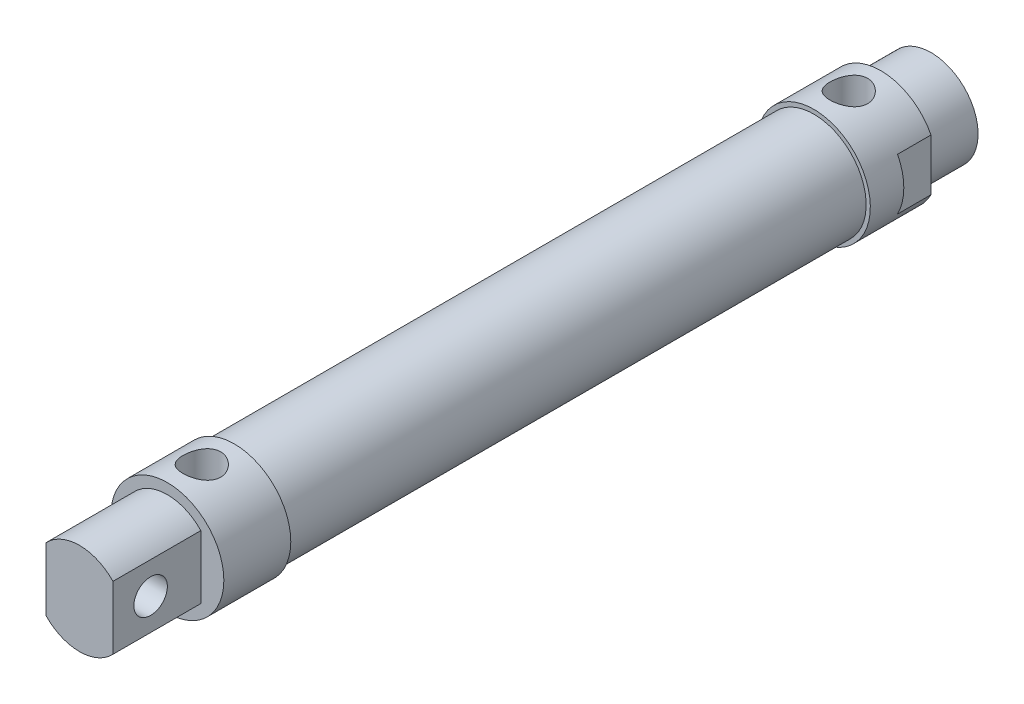
ISO-10303-21;
HEADER;
FILE_DESCRIPTION(('STEP AP214'),'2;1');
FILE_NAME('part.step','',(''),(''),'','','');
FILE_SCHEMA(('AUTOMOTIVE_DESIGN { 1 0 10303 214 1 1 1 1 }'));
ENDSEC;
DATA;
#1=APPLICATION_CONTEXT('core data for automotive mechanical design processes');
#2=APPLICATION_PROTOCOL_DEFINITION('international standard','automotive_design',2000,#1);
#3=PRODUCT_CONTEXT('',#1,'mechanical');
#4=PRODUCT('Part','Part','',(#3));
#5=PRODUCT_RELATED_PRODUCT_CATEGORY('part','',(#4));
#6=PRODUCT_DEFINITION_FORMATION('','',#4);
#7=PRODUCT_DEFINITION_CONTEXT('part definition',#1,'design');
#8=PRODUCT_DEFINITION('design','',#6,#7);
#9=PRODUCT_DEFINITION_SHAPE('','',#8);
#10=(LENGTH_UNIT() NAMED_UNIT(*) SI_UNIT(.MILLI.,.METRE.));
#11=(NAMED_UNIT(*) PLANE_ANGLE_UNIT() SI_UNIT($,.RADIAN.));
#12=(NAMED_UNIT(*) SI_UNIT($,.STERADIAN.) SOLID_ANGLE_UNIT());
#13=UNCERTAINTY_MEASURE_WITH_UNIT(LENGTH_MEASURE(1.E-05),#10,'distance_accuracy_value','');
#14=(GEOMETRIC_REPRESENTATION_CONTEXT(3) GLOBAL_UNCERTAINTY_ASSIGNED_CONTEXT((#13)) GLOBAL_UNIT_ASSIGNED_CONTEXT((#10,
#11,#12)) REPRESENTATION_CONTEXT('',''));
#15=CARTESIAN_POINT('',(0.,0.,0.));
#16=DIRECTION('',(0.,0.,1.));
#17=DIRECTION('',(1.,0.,0.));
#18=AXIS2_PLACEMENT_3D('',#15,#16,#17);
#19=CARTESIAN_POINT('',(0.,0.,-28.));
#20=DIRECTION('',(0.,0.,1.));
#21=DIRECTION('',(1.,0.,0.));
#22=AXIS2_PLACEMENT_3D('',#19,#20,#21);
#23=CYLINDRICAL_SURFACE('',#22,13.5);
#24=CARTESIAN_POINT('',(0.,13.5,-3.83214366522298));
#25=CARTESIAN_POINT('',(-0.245535132990254,13.5000006885425,-3.83214252343059));
#26=CARTESIAN_POINT('',(-0.491063375423474,13.4932396278395,-3.85230486279545));
#27=CARTESIAN_POINT('',(-0.974887923928375,13.4669344591476,-3.93217465490046));
#28=CARTESIAN_POINT('',(-1.21318347653468,13.4473890240969,-3.99188621299313));
#29=CARTESIAN_POINT('',(-1.67549755275799,13.3976388557899,-4.14858026045119));
#30=CARTESIAN_POINT('',(-1.89953921648715,13.3674519478884,-4.2455004462897));
#31=CARTESIAN_POINT('',(-2.32818721562396,13.2995000572804,-4.47357894299554));
#32=CARTESIAN_POINT('',(-2.53278970631418,13.2617335800502,-4.60474400773467));
#33=CARTESIAN_POINT('',(-2.92383753760019,13.1811342499351,-4.90235978708737));
#34=CARTESIAN_POINT('',(-3.10951665134237,13.1381800408698,-5.06978421939523));
#35=CARTESIAN_POINT('',(-3.4507471171594,13.052714165241,-5.43309586140249));
#36=CARTESIAN_POINT('',(-3.60629183470265,13.0102025980768,-5.62898932240115));
#37=CARTESIAN_POINT('',(-3.8872122400253,12.9290999614752,-6.05057668360718));
#38=CARTESIAN_POINT('',(-4.01159186199438,12.8906567673979,-6.27696549401804));
#39=CARTESIAN_POINT('',(-4.22018493245001,12.8238887438451,-6.74893609028592));
#40=CARTESIAN_POINT('',(-4.30441063824142,12.7955608272636,-6.9945119924534));
#41=CARTESIAN_POINT('',(-4.42743057679029,12.7535086470929,-7.48917316196003));
#42=CARTESIAN_POINT('',(-4.46766051721948,12.7393243095257,-7.73786110343059));
#43=CARTESIAN_POINT('',(-4.50603505500863,12.7258045484346,-8.23883055891762));
#44=CARTESIAN_POINT('',(-4.5041926572342,12.7264645364209,-8.49111093838891));
#45=CARTESIAN_POINT('',(-4.45958956665199,12.7421556749886,-8.97985850225647));
#46=CARTESIAN_POINT('',(-4.41870260920247,12.756528712653,-9.21652147846926));
#47=CARTESIAN_POINT('',(-4.30022773277463,12.7969495962214,-9.6794140535589));
#48=CARTESIAN_POINT('',(-4.22263541965274,12.8229988399107,-9.90564239970517));
#49=CARTESIAN_POINT('',(-4.03172576128583,12.8843060012851,-10.3455010383506));
#50=CARTESIAN_POINT('',(-3.91785321918668,12.919705460792,-10.5588697798267));
#51=CARTESIAN_POINT('',(-3.65800097836013,12.9956651358059,-10.9640627524909));
#52=CARTESIAN_POINT('',(-3.51201200563693,13.036226840543,-11.1558807364257));
#53=CARTESIAN_POINT('',(-3.18307199707122,13.1205298125777,-11.5230558569438));
#54=CARTESIAN_POINT('',(-2.99858917534371,13.1643265209758,-11.6970307905131));
#55=CARTESIAN_POINT('',(-2.60252806486498,13.2483122274088,-12.011934365209));
#56=CARTESIAN_POINT('',(-2.39094718047358,13.2885008792109,-12.1528598369634));
#57=CARTESIAN_POINT('',(-1.94376425870829,13.3612698572029,-12.3987770162806));
#58=CARTESIAN_POINT('',(-1.70794474387354,13.3937707503623,-12.5033983762562));
#59=CARTESIAN_POINT('',(-1.22071087514026,13.446925521499,-12.6710579480237));
#60=CARTESIAN_POINT('',(-0.969301971697287,13.4675835144694,-12.7341106046285));
#61=CARTESIAN_POINT('',(-0.469727232881875,13.494043218215,-12.8143941623236));
#62=CARTESIAN_POINT('',(-0.221893199391811,13.5004500825178,-12.8334928065004));
#63=CARTESIAN_POINT('',(0.273487814821069,13.4995006212672,-12.8306466340299));
#64=CARTESIAN_POINT('',(0.521034836938427,13.4921466188713,-12.8087087453135));
#65=CARTESIAN_POINT('',(1.00133939836915,13.4649011122697,-12.7258900804112));
#66=CARTESIAN_POINT('',(1.23431763075679,13.4453789420037,-12.6661557380003));
#67=CARTESIAN_POINT('',(1.68685181360808,13.3961331073531,-12.5108731651227));
#68=CARTESIAN_POINT('',(1.90640604828873,13.3664081421004,-12.4153203676179));
#69=CARTESIAN_POINT('',(2.33229733376973,13.298801907928,-12.1883267219394));
#70=CARTESIAN_POINT('',(2.53813481647716,13.2607266640104,-12.0560079954487));
#71=CARTESIAN_POINT('',(2.92529173561014,13.1807364262318,-11.7602699901623));
#72=CARTESIAN_POINT('',(3.10660365508009,13.1388202617222,-11.59684121308));
#73=CARTESIAN_POINT('',(3.44813628512835,13.05345815912,-11.2347392856933));
#74=CARTESIAN_POINT('',(3.60702436160597,13.0100292489343,-11.0348021440521));
#75=CARTESIAN_POINT('',(3.88915885045608,12.9284987982619,-10.610171610074));
#76=CARTESIAN_POINT('',(4.01240496568956,12.8903973021901,-10.3854780113696));
#77=CARTESIAN_POINT('',(4.21918618687362,12.8242076306123,-9.91761509641845));
#78=CARTESIAN_POINT('',(4.30280159474259,12.796099235684,-9.67448430896353));
#79=CARTESIAN_POINT('',(4.4275260004171,12.7534874537902,-9.17643974002439));
#80=CARTESIAN_POINT('',(4.46865414729273,12.7389779380638,-8.92153132090341));
#81=CARTESIAN_POINT('',(4.50574327114804,12.725903649338,-8.42125673303886));
#82=CARTESIAN_POINT('',(4.5039161578878,12.7265580115837,-8.17607313393227));
#83=CARTESIAN_POINT('',(4.46059032051912,12.741807142074,-7.6897008280737));
#84=CARTESIAN_POINT('',(4.41909395756363,12.7564010806213,-7.44851188442508));
#85=CARTESIAN_POINT('',(4.29917315908205,12.7973035937201,-6.98153318171185));
#86=CARTESIAN_POINT('',(4.22146505706981,12.8233844110115,-6.75553795270274));
#87=CARTESIAN_POINT('',(4.03190714591886,12.8842379468311,-6.31962033400077));
#88=CARTESIAN_POINT('',(3.92004975849213,12.9190125943527,-6.10970152487695));
#89=CARTESIAN_POINT('',(3.65967311662543,12.9952273151721,-5.70196715056988));
#90=CARTESIAN_POINT('',(3.50976709244061,13.0368920238962,-5.50507940668024));
#91=CARTESIAN_POINT('',(3.17989297411042,13.1212510327464,-5.13853950499408));
#92=CARTESIAN_POINT('',(2.99991638003167,13.1639456210568,-4.96889507462664));
#93=CARTESIAN_POINT('',(2.6065870061431,13.2475513736495,-4.65499380992167));
#94=CARTESIAN_POINT('',(2.39220681074878,13.2883281810565,-4.51198410034348));
#95=CARTESIAN_POINT('',(1.94110810832981,13.3616696027675,-4.26418673539507));
#96=CARTESIAN_POINT('',(1.70439533159557,13.3942363158568,-4.15938930857379));
#97=CARTESIAN_POINT('',(1.22622141240439,13.4462481780844,-3.99539631902395));
#98=CARTESIAN_POINT('',(0.98544490954384,13.4662145590135,-3.93437256703778));
#99=CARTESIAN_POINT('',(0.496441872046111,13.49308831789,-3.85275240217591));
#100=CARTESIAN_POINT('',(0.248217415059359,13.4999993039357,-3.83214481948856));
#101=CARTESIAN_POINT('',(0.,13.5,-3.83214366522298));
#102=B_SPLINE_CURVE_WITH_KNOTS('',3,(#24,#25,#26,#27,#28,#29,#30,#31,#32,#33,#34,#35,#36,#37,
#38,#39,#40,#41,#42,#43,#44,#45,#46,#47,#48,#49,#50,#51,#52,#53,#54,#55,#56,#57,#58,#59,#60,#61,
#62,#63,#64,#65,#66,#67,#68,#69,#70,#71,#72,#73,#74,#75,#76,#77,#78,#79,#80,#81,#82,#83,#84,#85,
#86,#87,#88,#89,#90,#91,#92,#93,#94,#95,#96,#97,#98,#99,#100,#101),.UNSPECIFIED.,.T.,.F.,(4,2,2,
2,2,2,2,2,2,2,2,2,2,2,2,2,2,2,2,2,2,2,2,2,2,2,2,2,2,2,2,2,2,2,2,2,2,2,4),(0.,0.735691977117049,
1.47146033370384,2.20600202791623,2.94068870009595,3.69831079272402,4.45609949793886,
5.23567731705617,6.0150170111775,6.7680866583828,7.52092352943684,8.23935719484116,
8.95787688856029,9.68796770204448,10.4182696151829,11.1866987615751,11.9552015685614,
12.7313282543297,13.507185099538,14.2494112429462,14.9915120924515,15.7121171090832,
16.4328140378483,17.1724679930317,17.9123481370487,18.6858460296974,19.4593503706385,
20.2312806222683,21.0028628118264,21.7348049729552,22.4667035708755,23.1847014186824,
23.9028587179826,24.6523530011948,25.4020595006336,26.1809847376431,26.9597106519241,
27.7036451268852,28.4473739717799),.UNSPECIFIED.);
#103=CARTESIAN_POINT('',(0.,13.5,-3.83214366522298));
#104=VERTEX_POINT('',#103);
#105=EDGE_CURVE('E35',#104,#104,#102,.T.);
#106=ORIENTED_EDGE('',*,*,#105,.T.);
#107=EDGE_LOOP('',(#106));
#108=FACE_BOUND('',#107,.T.);
#109=CARTESIAN_POINT('',(0.,0.,0.));
#110=DIRECTION('',(0.,0.,-1.));
#111=DIRECTION('',(-1.,0.,0.));
#112=AXIS2_PLACEMENT_3D('',#109,#110,#111);
#113=CIRCLE('',#112,13.5);
#114=CARTESIAN_POINT('',(-13.5,0.,0.));
#115=VERTEX_POINT('',#114);
#116=EDGE_CURVE('E166',#115,#115,#113,.T.);
#117=ORIENTED_EDGE('',*,*,#116,.T.);
#118=EDGE_LOOP('',(#117));
#119=FACE_BOUND('',#118,.T.);
#120=CARTESIAN_POINT('',(0.,0.,-16.));
#121=DIRECTION('',(0.,0.,-1.));
#122=DIRECTION('',(-1.,0.,0.));
#123=AXIS2_PLACEMENT_3D('',#120,#121,#122);
#124=CIRCLE('',#123,13.5);
#125=CARTESIAN_POINT('',(-12.,6.18465843842649,-16.));
#126=VERTEX_POINT('',#125);
#127=CARTESIAN_POINT('',(12.,6.18465843842649,-16.));
#128=VERTEX_POINT('',#127);
#129=EDGE_CURVE('E51',#126,#128,#124,.T.);
#130=ORIENTED_EDGE('',*,*,#129,.F.);
#131=DIRECTION('',(0.,0.,-1.));
#132=VECTOR('',#131,1.);
#133=CARTESIAN_POINT('',(-12.,6.18465843842649,-8.));
#134=LINE('',#133,#132);
#135=CARTESIAN_POINT('',(-12.,6.18465843842649,-8.));
#136=VERTEX_POINT('',#135);
#137=EDGE_CURVE('E129',#136,#126,#134,.T.);
#138=ORIENTED_EDGE('',*,*,#137,.F.);
#139=CARTESIAN_POINT('',(0.,0.,-8.));
#140=DIRECTION('',(0.,0.,-1.));
#141=DIRECTION('',(-1.,0.,0.));
#142=AXIS2_PLACEMENT_3D('',#139,#140,#141);
#143=CIRCLE('',#142,13.5);
#144=CARTESIAN_POINT('',(-12.,-6.18465843842649,-8.));
#145=VERTEX_POINT('',#144);
#146=EDGE_CURVE('E120',#145,#136,#143,.T.);
#147=ORIENTED_EDGE('',*,*,#146,.F.);
#148=DIRECTION('',(0.,0.,-1.));
#149=VECTOR('',#148,1.);
#150=CARTESIAN_POINT('',(-12.,-6.18465843842649,-8.));
#151=LINE('',#150,#149);
#152=CARTESIAN_POINT('',(-12.,-6.18465843842649,-16.));
#153=VERTEX_POINT('',#152);
#154=EDGE_CURVE('E111',#145,#153,#151,.T.);
#155=ORIENTED_EDGE('',*,*,#154,.T.);
#156=CARTESIAN_POINT('',(12.,-6.18465843842649,-16.));
#157=VERTEX_POINT('',#156);
#158=EDGE_CURVE('E100',#157,#153,#124,.T.);
#159=ORIENTED_EDGE('',*,*,#158,.F.);
#160=DIRECTION('',(0.,0.,-1.));
#161=VECTOR('',#160,1.);
#162=CARTESIAN_POINT('',(12.,-6.18465843842649,-8.));
#163=LINE('',#162,#161);
#164=CARTESIAN_POINT('',(12.,-6.18465843842649,-8.));
#165=VERTEX_POINT('',#164);
#166=EDGE_CURVE('E109',#165,#157,#163,.T.);
#167=ORIENTED_EDGE('',*,*,#166,.F.);
#168=CARTESIAN_POINT('',(0.,0.,-8.));
#169=DIRECTION('',(0.,0.,-1.));
#170=DIRECTION('',(-1.,0.,0.));
#171=AXIS2_PLACEMENT_3D('',#168,#169,#170);
#172=CIRCLE('',#171,13.5);
#173=CARTESIAN_POINT('',(12.,6.18465843842649,-8.));
#174=VERTEX_POINT('',#173);
#175=EDGE_CURVE('E122',#174,#165,#172,.T.);
#176=ORIENTED_EDGE('',*,*,#175,.F.);
#177=DIRECTION('',(0.,0.,-1.));
#178=VECTOR('',#177,1.);
#179=CARTESIAN_POINT('',(12.,6.18465843842649,-8.));
#180=LINE('',#179,#178);
#181=EDGE_CURVE('E118',#174,#128,#180,.T.);
#182=ORIENTED_EDGE('',*,*,#181,.T.);
#183=EDGE_LOOP('',(#130,#138,#147,#155,#159,#167,#176,#182));
#184=FACE_BOUND('',#183,.T.);
#185=ADVANCED_FACE('F31',(#108,#119,#184),#23,.T.);
#186=CARTESIAN_POINT('',(-12.,6.18465843842649,-8.));
#187=DIRECTION('',(1.,0.,0.));
#188=DIRECTION('',(0.,0.,-1.));
#189=AXIS2_PLACEMENT_3D('',#186,#187,#188);
#190=PLANE('',#189);
#191=DIRECTION('',(0.,1.,0.));
#192=VECTOR('',#191,1.);
#193=CARTESIAN_POINT('',(-12.,6.18465843842649,-16.));
#194=LINE('',#193,#192);
#195=EDGE_CURVE('E444',#153,#126,#194,.T.);
#196=ORIENTED_EDGE('',*,*,#195,.F.);
#197=ORIENTED_EDGE('',*,*,#154,.F.);
#198=DIRECTION('',(0.,-1.,0.));
#199=VECTOR('',#198,1.);
#200=CARTESIAN_POINT('',(-12.,6.18465843842649,-8.));
#201=LINE('',#200,#199);
#202=EDGE_CURVE('E126',#136,#145,#201,.T.);
#203=ORIENTED_EDGE('',*,*,#202,.F.);
#204=ORIENTED_EDGE('',*,*,#137,.T.);
#205=EDGE_LOOP('',(#196,#197,#203,#204));
#206=FACE_BOUND('',#205,.T.);
#207=ADVANCED_FACE('F212',(#206),#190,.F.);
#208=CARTESIAN_POINT('',(12.,6.18465843842649,-8.));
#209=DIRECTION('',(-1.,0.,0.));
#210=DIRECTION('',(0.,-1.,0.));
#211=AXIS2_PLACEMENT_3D('',#208,#209,#210);
#212=PLANE('',#211);
#213=DIRECTION('',(0.,-1.,0.));
#214=VECTOR('',#213,1.);
#215=CARTESIAN_POINT('',(12.,6.18465843842649,-16.));
#216=LINE('',#215,#214);
#217=EDGE_CURVE('E12',#128,#157,#216,.T.);
#218=ORIENTED_EDGE('',*,*,#217,.F.);
#219=ORIENTED_EDGE('',*,*,#181,.F.);
#220=DIRECTION('',(0.,1.,0.));
#221=VECTOR('',#220,1.);
#222=CARTESIAN_POINT('',(12.,6.18465843842649,-8.));
#223=LINE('',#222,#221);
#224=EDGE_CURVE('E117',#165,#174,#223,.T.);
#225=ORIENTED_EDGE('',*,*,#224,.F.);
#226=ORIENTED_EDGE('',*,*,#166,.T.);
#227=EDGE_LOOP('',(#218,#219,#225,#226));
#228=FACE_BOUND('',#227,.T.);
#229=ADVANCED_FACE('F115',(#228),#212,.F.);
#230=CARTESIAN_POINT('',(0.,0.,175.5));
#231=DIRECTION('',(0.,0.,-1.));
#232=DIRECTION('',(-1.,0.,0.));
#233=AXIS2_PLACEMENT_3D('',#230,#231,#232);
#234=CYLINDRICAL_SURFACE('',#233,13.5);
#235=CARTESIAN_POINT('',(0.,13.5,150.76682811308));
#236=CARTESIAN_POINT('',(-0.245535132990255,13.5000006885425,150.766829254872));
#237=CARTESIAN_POINT('',(-0.491063375423474,13.4932396278395,150.746666915507));
#238=CARTESIAN_POINT('',(-0.974887923928374,13.4669344591476,150.666797123402));
#239=CARTESIAN_POINT('',(-1.21318347653468,13.4473890240969,150.60708556531));
#240=CARTESIAN_POINT('',(-1.67549755275799,13.3976388557899,150.450391517852));
#241=CARTESIAN_POINT('',(-1.89953921648715,13.3674519478884,150.353471332013));
#242=CARTESIAN_POINT('',(-2.32818721562396,13.2995000572804,150.125392835307));
#243=CARTESIAN_POINT('',(-2.53278970631418,13.2617335800501,149.994227770568));
#244=CARTESIAN_POINT('',(-2.9238375376002,13.1811342499351,149.696611991216));
#245=CARTESIAN_POINT('',(-3.10951665134238,13.1381800408698,149.529187558908));
#246=CARTESIAN_POINT('',(-3.4507471171594,13.052714165241,149.1658759169));
#247=CARTESIAN_POINT('',(-3.60629183470265,13.0102025980768,148.969982455902));
#248=CARTESIAN_POINT('',(-3.88721224002529,12.9290999614752,148.548395094696));
#249=CARTESIAN_POINT('',(-4.01159186199438,12.8906567673979,148.322006284285));
#250=CARTESIAN_POINT('',(-4.22018493245001,12.8238887438451,147.850035688017));
#251=CARTESIAN_POINT('',(-4.30441063824142,12.7955608272636,147.60445978585));
#252=CARTESIAN_POINT('',(-4.42743057679029,12.7535086470929,147.109798616343));
#253=CARTESIAN_POINT('',(-4.46766051721948,12.7393243095257,146.861110674872));
#254=CARTESIAN_POINT('',(-4.50603505500863,12.7258045484346,146.360141219385));
#255=CARTESIAN_POINT('',(-4.5041926572342,12.7264645364209,146.107860839914));
#256=CARTESIAN_POINT('',(-4.45958956665199,12.7421556749886,145.619113276046));
#257=CARTESIAN_POINT('',(-4.41870260920246,12.756528712653,145.382450299834));
#258=CARTESIAN_POINT('',(-4.30022773277462,12.7969495962214,144.919557724744));
#259=CARTESIAN_POINT('',(-4.22263541965274,12.8229988399107,144.693329378598));
#260=CARTESIAN_POINT('',(-4.03172576128584,12.8843060012851,144.253470739952));
#261=CARTESIAN_POINT('',(-3.91785321918669,12.919705460792,144.040101998476));
#262=CARTESIAN_POINT('',(-3.65800097836015,12.9956651358059,143.634909025812));
#263=CARTESIAN_POINT('',(-3.51201200563693,13.036226840543,143.443091041877));
#264=CARTESIAN_POINT('',(-3.18307199707121,13.1205298125777,143.075915921359));
#265=CARTESIAN_POINT('',(-2.99858917534371,13.1643265209758,142.90194098779));
#266=CARTESIAN_POINT('',(-2.60252806486499,13.2483122274088,142.587037413094));
#267=CARTESIAN_POINT('',(-2.3909471804736,13.2885008792109,142.44611194134));
#268=CARTESIAN_POINT('',(-1.9437642587083,13.3612698572029,142.200194762022));
#269=CARTESIAN_POINT('',(-1.70794474387355,13.3937707503623,142.095573402047));
#270=CARTESIAN_POINT('',(-1.22071087514026,13.446925521499,141.927913830279));
#271=CARTESIAN_POINT('',(-0.969301971697278,13.4675835144694,141.864861173674));
#272=CARTESIAN_POINT('',(-0.469727232881862,13.494043218215,141.784577615979));
#273=CARTESIAN_POINT('',(-0.221893199391799,13.5004500825178,141.765478971803));
#274=CARTESIAN_POINT('',(0.273487814821077,13.4995006212672,141.768325144273));
#275=CARTESIAN_POINT('',(0.521034836938433,13.4921466188713,141.790263032989));
#276=CARTESIAN_POINT('',(1.00133939836915,13.4649011122697,141.873081697892));
#277=CARTESIAN_POINT('',(1.2343176307568,13.4453789420037,141.932816040303));
#278=CARTESIAN_POINT('',(1.68685181360808,13.3961331073531,142.08809861318));
#279=CARTESIAN_POINT('',(1.90640604828873,13.3664081421004,142.183651410685));
#280=CARTESIAN_POINT('',(2.33229733376973,13.298801907928,142.410645056363));
#281=CARTESIAN_POINT('',(2.53813481647716,13.2607266640104,142.542963782854));
#282=CARTESIAN_POINT('',(2.92529173561014,13.1807364262318,142.838701788141));
#283=CARTESIAN_POINT('',(3.1066036550801,13.1388202617222,143.002130565223));
#284=CARTESIAN_POINT('',(3.44813628512835,13.05345815912,143.36423249261));
#285=CARTESIAN_POINT('',(3.60702436160597,13.0100292489343,143.564169634251));
#286=CARTESIAN_POINT('',(3.88915885045609,12.9284987982619,143.988800168229));
#287=CARTESIAN_POINT('',(4.01240496568956,12.8903973021901,144.213493766933));
#288=CARTESIAN_POINT('',(4.21918618687362,12.8242076306123,144.681356681884));
#289=CARTESIAN_POINT('',(4.30280159474259,12.796099235684,144.924487469339));
#290=CARTESIAN_POINT('',(4.4275260004171,12.7534874537902,145.422532038279));
#291=CARTESIAN_POINT('',(4.46865414729273,12.7389779380638,145.6774404574));
#292=CARTESIAN_POINT('',(4.50574327114804,12.725903649338,146.177715045264));
#293=CARTESIAN_POINT('',(4.5039161578878,12.7265580115837,146.422898644371));
#294=CARTESIAN_POINT('',(4.46059032051912,12.741807142074,146.909270950229));
#295=CARTESIAN_POINT('',(4.41909395756363,12.7564010806213,147.150459893878));
#296=CARTESIAN_POINT('',(4.29917315908205,12.7973035937201,147.617438596591));
#297=CARTESIAN_POINT('',(4.22146505706981,12.8233844110115,147.8434338256));
#298=CARTESIAN_POINT('',(4.03190714591886,12.8842379468311,148.279351444302));
#299=CARTESIAN_POINT('',(3.92004975849212,12.9190125943527,148.489270253426));
#300=CARTESIAN_POINT('',(3.65967311662543,12.9952273151721,148.897004627733));
#301=CARTESIAN_POINT('',(3.50976709244061,13.0368920238962,149.093892371623));
#302=CARTESIAN_POINT('',(3.17989297411042,13.1212510327464,149.460432273309));
#303=CARTESIAN_POINT('',(2.99991638003166,13.1639456210568,149.630076703676));
#304=CARTESIAN_POINT('',(2.60658700614309,13.2475513736495,149.943977968381));
#305=CARTESIAN_POINT('',(2.39220681074877,13.2883281810566,150.086987677959));
#306=CARTESIAN_POINT('',(1.94110810832981,13.3616696027675,150.334785042908));
#307=CARTESIAN_POINT('',(1.70439533159557,13.3942363158568,150.439582469729));
#308=CARTESIAN_POINT('',(1.22622141240439,13.4462481780844,150.603575459279));
#309=CARTESIAN_POINT('',(0.985444909543841,13.4662145590135,150.664599211265));
#310=CARTESIAN_POINT('',(0.496441872046113,13.49308831789,150.746219376127));
#311=CARTESIAN_POINT('',(0.248217415059359,13.4999993039357,150.766826958814));
#312=CARTESIAN_POINT('',(0.,13.5,150.76682811308));
#313=B_SPLINE_CURVE_WITH_KNOTS('',3,(#235,#236,#237,#238,#239,#240,#241,#242,#243,#244,#245,
#246,#247,#248,#249,#250,#251,#252,#253,#254,#255,#256,#257,#258,#259,#260,#261,#262,#263,#264,
#265,#266,#267,#268,#269,#270,#271,#272,#273,#274,#275,#276,#277,#278,#279,#280,#281,#282,#283,
#284,#285,#286,#287,#288,#289,#290,#291,#292,#293,#294,#295,#296,#297,#298,#299,#300,#301,#302,
#303,#304,#305,#306,#307,#308,#309,#310,#311,#312),.UNSPECIFIED.,.T.,.F.,(4,2,2,2,2,2,2,2,2,2,2,
2,2,2,2,2,2,2,2,2,2,2,2,2,2,2,2,2,2,2,2,2,2,2,2,2,2,2,4),(0.,0.73569197711705,1.47146033370384,
2.20600202791623,2.94068870009594,3.69831079272402,4.45609949793886,5.23567731705617,
6.01501701117749,6.76808665838279,7.52092352943686,8.23935719484117,8.95787688856028,
9.68796770204444,10.4182696151829,11.1866987615751,11.9552015685614,12.7313282543297,
13.507185099538,14.2494112429462,14.9915120924516,15.7121171090832,16.4328140378483,
17.1724679930317,17.9123481370487,18.6858460296974,19.4593503706385,20.2312806222683,
21.0028628118264,21.7348049729552,22.4667035708755,23.1847014186824,23.9028587179826,
24.6523530011948,25.4020595006337,26.1809847376431,26.9597106519241,27.7036451268852,
28.4473739717799),.UNSPECIFIED.);
#314=CARTESIAN_POINT('',(0.,13.5,150.76682811308));
#315=VERTEX_POINT('',#314);
#316=EDGE_CURVE('E180',#315,#315,#313,.T.);
#317=ORIENTED_EDGE('',*,*,#316,.T.);
#318=EDGE_LOOP('',(#317));
#319=FACE_BOUND('',#318,.T.);
#320=CARTESIAN_POINT('',(0.,0.,138.5));
#321=DIRECTION('',(0.,0.,1.));
#322=DIRECTION('',(1.,0.,0.));
#323=AXIS2_PLACEMENT_3D('',#320,#321,#322);
#324=CIRCLE('',#323,13.5);
#325=CARTESIAN_POINT('',(13.5,0.,138.5));
#326=VERTEX_POINT('',#325);
#327=EDGE_CURVE('E174',#326,#326,#324,.T.);
#328=ORIENTED_EDGE('',*,*,#327,.T.);
#329=EDGE_LOOP('',(#328));
#330=FACE_BOUND('',#329,.T.);
#331=CARTESIAN_POINT('',(0.,0.,154.5));
#332=DIRECTION('',(0.,0.,1.));
#333=DIRECTION('',(1.,0.,0.));
#334=AXIS2_PLACEMENT_3D('',#331,#332,#333);
#335=CIRCLE('',#334,13.5);
#336=CARTESIAN_POINT('',(13.5,0.,154.5));
#337=VERTEX_POINT('',#336);
#338=EDGE_CURVE('E161',#337,#337,#335,.T.);
#339=ORIENTED_EDGE('',*,*,#338,.F.);
#340=EDGE_LOOP('',(#339));
#341=FACE_BOUND('',#340,.T.);
#342=ADVANCED_FACE('F187',(#319,#330,#341),#234,.T.);
#343=CARTESIAN_POINT('',(0.,0.,138.5));
#344=DIRECTION('',(0.,0.,-1.));
#345=DIRECTION('',(-1.,0.,0.));
#346=AXIS2_PLACEMENT_3D('',#343,#344,#345);
#347=CYLINDRICAL_SURFACE('',#346,12.5);
#348=CARTESIAN_POINT('',(0.,0.,138.5));
#349=DIRECTION('',(0.,0.,1.));
#350=DIRECTION('',(1.,0.,0.));
#351=AXIS2_PLACEMENT_3D('',#348,#349,#350);
#352=CIRCLE('',#351,12.5);
#353=CARTESIAN_POINT('',(12.5,0.,138.5));
#354=VERTEX_POINT('',#353);
#355=EDGE_CURVE('E44',#354,#354,#352,.T.);
#356=ORIENTED_EDGE('',*,*,#355,.F.);
#357=EDGE_LOOP('',(#356));
#358=FACE_BOUND('',#357,.T.);
#359=CARTESIAN_POINT('',(0.,0.,0.));
#360=DIRECTION('',(0.,0.,-1.));
#361=DIRECTION('',(-1.,0.,0.));
#362=AXIS2_PLACEMENT_3D('',#359,#360,#361);
#363=CIRCLE('',#362,12.5);
#364=CARTESIAN_POINT('',(-12.5,0.,0.));
#365=VERTEX_POINT('',#364);
#366=EDGE_CURVE('E171',#365,#365,#363,.T.);
#367=ORIENTED_EDGE('',*,*,#366,.F.);
#368=EDGE_LOOP('',(#367));
#369=FACE_BOUND('',#368,.T.);
#370=ADVANCED_FACE('F33',(#358,#369),#347,.T.);
#371=CARTESIAN_POINT('',(0.,0.,138.5));
#372=DIRECTION('',(0.,0.,1.));
#373=DIRECTION('',(1.,0.,0.));
#374=AXIS2_PLACEMENT_3D('',#371,#372,#373);
#375=PLANE('',#374);
#376=ORIENTED_EDGE('',*,*,#327,.F.);
#377=EDGE_LOOP('',(#376));
#378=FACE_BOUND('',#377,.T.);
#379=ORIENTED_EDGE('',*,*,#355,.T.);
#380=EDGE_LOOP('',(#379));
#381=FACE_BOUND('',#380,.T.);
#382=ADVANCED_FACE('F254',(#378,#381),#375,.F.);
#383=CARTESIAN_POINT('',(0.,0.,175.5));
#384=DIRECTION('',(0.,0.,1.));
#385=DIRECTION('',(1.,0.,0.));
#386=AXIS2_PLACEMENT_3D('',#383,#384,#385);
#387=PLANE('',#386);
#388=CARTESIAN_POINT('',(0.,0.,175.5));
#389=DIRECTION('',(0.,0.,-1.));
#390=DIRECTION('',(1.,0.,0.));
#391=AXIS2_PLACEMENT_3D('',#388,#389,#390);
#392=CIRCLE('',#391,11.);
#393=CARTESIAN_POINT('',(-8.,7.54983443527075,175.5));
#394=VERTEX_POINT('',#393);
#395=CARTESIAN_POINT('',(7.99999999999999,7.54983443527075,175.5));
#396=VERTEX_POINT('',#395);
#397=EDGE_CURVE('E131',#394,#396,#392,.T.);
#398=ORIENTED_EDGE('',*,*,#397,.F.);
#399=DIRECTION('',(0.,1.,0.));
#400=VECTOR('',#399,1.);
#401=CARTESIAN_POINT('',(-8.,10.8742815854658,175.5));
#402=LINE('',#401,#400);
#403=CARTESIAN_POINT('',(-8.,-7.54983443527075,175.5));
#404=VERTEX_POINT('',#403);
#405=EDGE_CURVE('E158',#404,#394,#402,.T.);
#406=ORIENTED_EDGE('',*,*,#405,.F.);
#407=CARTESIAN_POINT('',(0.,0.,175.5));
#408=DIRECTION('',(0.,0.,-1.));
#409=DIRECTION('',(1.,0.,0.));
#410=AXIS2_PLACEMENT_3D('',#407,#408,#409);
#411=CIRCLE('',#410,11.);
#412=CARTESIAN_POINT('',(8.,-7.54983443527075,175.5));
#413=VERTEX_POINT('',#412);
#414=EDGE_CURVE('E140',#413,#404,#411,.T.);
#415=ORIENTED_EDGE('',*,*,#414,.F.);
#416=DIRECTION('',(0.,-1.,0.));
#417=VECTOR('',#416,1.);
#418=CARTESIAN_POINT('',(7.99999999999999,10.8742815854658,175.5));
#419=LINE('',#418,#417);
#420=EDGE_CURVE('E159',#396,#413,#419,.T.);
#421=ORIENTED_EDGE('',*,*,#420,.F.);
#422=EDGE_LOOP('',(#398,#406,#415,#421));
#423=FACE_BOUND('',#422,.T.);
#424=ADVANCED_FACE('F247',(#423),#387,.T.);
#425=CARTESIAN_POINT('',(0.,0.,0.));
#426=DIRECTION('',(0.,0.,-1.));
#427=DIRECTION('',(-1.,0.,0.));
#428=AXIS2_PLACEMENT_3D('',#425,#426,#427);
#429=PLANE('',#428);
#430=ORIENTED_EDGE('',*,*,#116,.F.);
#431=EDGE_LOOP('',(#430));
#432=FACE_BOUND('',#431,.T.);
#433=ORIENTED_EDGE('',*,*,#366,.T.);
#434=EDGE_LOOP('',(#433));
#435=FACE_BOUND('',#434,.T.);
#436=ADVANCED_FACE('F241',(#432,#435),#429,.F.);
#437=CARTESIAN_POINT('',(-8.,10.8742815854658,154.5));
#438=DIRECTION('',(1.,0.,0.));
#439=DIRECTION('',(0.,0.,-1.));
#440=AXIS2_PLACEMENT_3D('',#437,#438,#439);
#441=PLANE('',#440);
#442=CARTESIAN_POINT('',(-8.,0.,166.5));
#443=DIRECTION('',(-1.,0.,0.));
#444=DIRECTION('',(0.,0.,1.));
#445=AXIS2_PLACEMENT_3D('',#442,#443,#444);
#446=CIRCLE('',#445,3.99999999999999);
#447=CARTESIAN_POINT('',(-8.,0.,170.5));
#448=VERTEX_POINT('',#447);
#449=EDGE_CURVE('E150',#448,#448,#446,.T.);
#450=ORIENTED_EDGE('',*,*,#449,.F.);
#451=EDGE_LOOP('',(#450));
#452=FACE_BOUND('',#451,.T.);
#453=ORIENTED_EDGE('',*,*,#405,.T.);
#454=DIRECTION('',(0.,0.,1.));
#455=VECTOR('',#454,1.);
#456=CARTESIAN_POINT('',(-8.,7.54983443527075,154.5));
#457=LINE('',#456,#455);
#458=CARTESIAN_POINT('',(-8.,7.54983443527075,154.5));
#459=VERTEX_POINT('',#458);
#460=EDGE_CURVE('E135',#459,#394,#457,.T.);
#461=ORIENTED_EDGE('',*,*,#460,.F.);
#462=DIRECTION('',(0.,1.,0.));
#463=VECTOR('',#462,1.);
#464=CARTESIAN_POINT('',(-8.,10.8742815854658,154.5));
#465=LINE('',#464,#463);
#466=CARTESIAN_POINT('',(-8.,-7.54983443527075,154.5));
#467=VERTEX_POINT('',#466);
#468=EDGE_CURVE('E164',#467,#459,#465,.T.);
#469=ORIENTED_EDGE('',*,*,#468,.F.);
#470=DIRECTION('',(0.,0.,1.));
#471=VECTOR('',#470,1.);
#472=CARTESIAN_POINT('',(-8.,-7.54983443527075,154.5));
#473=LINE('',#472,#471);
#474=EDGE_CURVE('E145',#467,#404,#473,.T.);
#475=ORIENTED_EDGE('',*,*,#474,.T.);
#476=EDGE_LOOP('',(#453,#461,#469,#475));
#477=FACE_BOUND('',#476,.T.);
#478=ADVANCED_FACE('F238',(#452,#477),#441,.F.);
#479=CARTESIAN_POINT('',(0.,0.,154.5));
#480=DIRECTION('',(0.,0.,1.));
#481=DIRECTION('',(1.,0.,0.));
#482=AXIS2_PLACEMENT_3D('',#479,#480,#481);
#483=PLANE('',#482);
#484=ORIENTED_EDGE('',*,*,#468,.T.);
#485=CARTESIAN_POINT('',(0.,0.,154.5));
#486=DIRECTION('',(0.,0.,-1.));
#487=DIRECTION('',(1.,0.,0.));
#488=AXIS2_PLACEMENT_3D('',#485,#486,#487);
#489=CIRCLE('',#488,11.);
#490=CARTESIAN_POINT('',(7.99999999999999,7.54983443527075,154.5));
#491=VERTEX_POINT('',#490);
#492=EDGE_CURVE('E59',#459,#491,#489,.T.);
#493=ORIENTED_EDGE('',*,*,#492,.T.);
#494=DIRECTION('',(0.,-1.,0.));
#495=VECTOR('',#494,1.);
#496=CARTESIAN_POINT('',(7.99999999999999,10.8742815854658,154.5));
#497=LINE('',#496,#495);
#498=CARTESIAN_POINT('',(8.,-7.54983443527075,154.5));
#499=VERTEX_POINT('',#498);
#500=EDGE_CURVE('E156',#491,#499,#497,.T.);
#501=ORIENTED_EDGE('',*,*,#500,.T.);
#502=CARTESIAN_POINT('',(0.,0.,154.5));
#503=DIRECTION('',(0.,0.,-1.));
#504=DIRECTION('',(1.,0.,0.));
#505=AXIS2_PLACEMENT_3D('',#502,#503,#504);
#506=CIRCLE('',#505,11.);
#507=EDGE_CURVE('E142',#499,#467,#506,.T.);
#508=ORIENTED_EDGE('',*,*,#507,.T.);
#509=EDGE_LOOP('',(#484,#493,#501,#508));
#510=FACE_BOUND('',#509,.T.);
#511=ORIENTED_EDGE('',*,*,#338,.T.);
#512=EDGE_LOOP('',(#511));
#513=FACE_BOUND('',#512,.T.);
#514=ADVANCED_FACE('F234',(#510,#513),#483,.T.);
#515=CARTESIAN_POINT('',(7.99999999999999,10.8742815854658,154.5));
#516=DIRECTION('',(-1.,0.,0.));
#517=DIRECTION('',(0.,-1.,0.));
#518=AXIS2_PLACEMENT_3D('',#515,#516,#517);
#519=PLANE('',#518);
#520=CARTESIAN_POINT('',(8.,0.,166.5));
#521=DIRECTION('',(-1.,0.,0.));
#522=DIRECTION('',(0.,-1.,0.));
#523=AXIS2_PLACEMENT_3D('',#520,#521,#522);
#524=CIRCLE('',#523,3.99999999999999);
#525=CARTESIAN_POINT('',(8.,-3.99999999999999,166.5));
#526=VERTEX_POINT('',#525);
#527=EDGE_CURVE('E155',#526,#526,#524,.T.);
#528=ORIENTED_EDGE('',*,*,#527,.T.);
#529=EDGE_LOOP('',(#528));
#530=FACE_BOUND('',#529,.T.);
#531=ORIENTED_EDGE('',*,*,#500,.F.);
#532=DIRECTION('',(0.,0.,1.));
#533=VECTOR('',#532,1.);
#534=CARTESIAN_POINT('',(7.99999999999999,7.54983443527075,154.5));
#535=LINE('',#534,#533);
#536=EDGE_CURVE('E137',#491,#396,#535,.T.);
#537=ORIENTED_EDGE('',*,*,#536,.T.);
#538=ORIENTED_EDGE('',*,*,#420,.T.);
#539=DIRECTION('',(0.,0.,1.));
#540=VECTOR('',#539,1.);
#541=CARTESIAN_POINT('',(8.,-7.54983443527075,154.5));
#542=LINE('',#541,#540);
#543=EDGE_CURVE('E147',#499,#413,#542,.T.);
#544=ORIENTED_EDGE('',*,*,#543,.F.);
#545=EDGE_LOOP('',(#531,#537,#538,#544));
#546=FACE_BOUND('',#545,.T.);
#547=ADVANCED_FACE('F230',(#530,#546),#519,.F.);
#548=CARTESIAN_POINT('',(13.5,0.,166.5));
#549=DIRECTION('',(-1.,0.,0.));
#550=DIRECTION('',(0.,0.,1.));
#551=AXIS2_PLACEMENT_3D('',#548,#549,#550);
#552=CYLINDRICAL_SURFACE('',#551,3.99999999999999);
#553=ORIENTED_EDGE('',*,*,#449,.T.);
#554=EDGE_LOOP('',(#553));
#555=FACE_BOUND('',#554,.T.);
#556=ORIENTED_EDGE('',*,*,#527,.F.);
#557=EDGE_LOOP('',(#556));
#558=FACE_BOUND('',#557,.T.);
#559=ADVANCED_FACE('F226',(#555,#558),#552,.F.);
#560=CARTESIAN_POINT('',(0.,0.,154.5));
#561=DIRECTION('',(0.,0.,1.));
#562=DIRECTION('',(1.,0.,0.));
#563=AXIS2_PLACEMENT_3D('',#560,#561,#562);
#564=CYLINDRICAL_SURFACE('',#563,11.);
#565=ORIENTED_EDGE('',*,*,#414,.T.);
#566=ORIENTED_EDGE('',*,*,#474,.F.);
#567=ORIENTED_EDGE('',*,*,#507,.F.);
#568=ORIENTED_EDGE('',*,*,#543,.T.);
#569=EDGE_LOOP('',(#565,#566,#567,#568));
#570=FACE_BOUND('',#569,.T.);
#571=ADVANCED_FACE('F222',(#570),#564,.T.);
#572=CARTESIAN_POINT('',(0.,0.,154.5));
#573=DIRECTION('',(0.,0.,1.));
#574=DIRECTION('',(1.,0.,0.));
#575=AXIS2_PLACEMENT_3D('',#572,#573,#574);
#576=CYLINDRICAL_SURFACE('',#575,11.);
#577=ORIENTED_EDGE('',*,*,#397,.T.);
#578=ORIENTED_EDGE('',*,*,#536,.F.);
#579=ORIENTED_EDGE('',*,*,#492,.F.);
#580=ORIENTED_EDGE('',*,*,#460,.T.);
#581=EDGE_LOOP('',(#577,#578,#579,#580));
#582=FACE_BOUND('',#581,.T.);
#583=ADVANCED_FACE('F215',(#582),#576,.T.);
#584=CARTESIAN_POINT('',(0.,0.,-8.));
#585=DIRECTION('',(0.,0.,-1.));
#586=DIRECTION('',(-1.,0.,0.));
#587=AXIS2_PLACEMENT_3D('',#584,#585,#586);
#588=PLANE('',#587);
#589=ORIENTED_EDGE('',*,*,#146,.T.);
#590=ORIENTED_EDGE('',*,*,#202,.T.);
#591=EDGE_LOOP('',(#589,#590));
#592=FACE_BOUND('',#591,.T.);
#593=ADVANCED_FACE('F208',(#592),#588,.T.);
#594=CARTESIAN_POINT('',(0.,0.,-8.));
#595=DIRECTION('',(0.,0.,-1.));
#596=DIRECTION('',(-1.,0.,0.));
#597=AXIS2_PLACEMENT_3D('',#594,#595,#596);
#598=PLANE('',#597);
#599=ORIENTED_EDGE('',*,*,#175,.T.);
#600=ORIENTED_EDGE('',*,*,#224,.T.);
#601=EDGE_LOOP('',(#599,#600));
#602=FACE_BOUND('',#601,.T.);
#603=ADVANCED_FACE('F204',(#602),#598,.T.);
#604=CARTESIAN_POINT('',(0.,0.,-16.));
#605=DIRECTION('',(0.,0.,-1.));
#606=DIRECTION('',(-1.,0.,0.));
#607=AXIS2_PLACEMENT_3D('',#604,#605,#606);
#608=PLANE('',#607);
#609=CARTESIAN_POINT('',(0.,0.,-16.));
#610=DIRECTION('',(0.,0.,-1.));
#611=DIRECTION('',(-1.,0.,0.));
#612=AXIS2_PLACEMENT_3D('',#609,#610,#611);
#613=CIRCLE('',#612,11.25);
#614=CARTESIAN_POINT('',(-11.25,0.,-16.));
#615=VERTEX_POINT('',#614);
#616=EDGE_CURVE('E112',#615,#615,#613,.T.);
#617=ORIENTED_EDGE('',*,*,#616,.F.);
#618=EDGE_LOOP('',(#617));
#619=FACE_BOUND('',#618,.T.);
#620=ORIENTED_EDGE('',*,*,#195,.T.);
#621=ORIENTED_EDGE('',*,*,#129,.T.);
#622=ORIENTED_EDGE('',*,*,#217,.T.);
#623=ORIENTED_EDGE('',*,*,#158,.T.);
#624=EDGE_LOOP('',(#620,#621,#622,#623));
#625=FACE_BOUND('',#624,.T.);
#626=ADVANCED_FACE('F99',(#619,#625),#608,.T.);
#627=CARTESIAN_POINT('',(0.,0.,-16.));
#628=DIRECTION('',(0.,0.,-1.));
#629=DIRECTION('',(-1.,0.,0.));
#630=AXIS2_PLACEMENT_3D('',#627,#628,#629);
#631=CYLINDRICAL_SURFACE('',#630,11.25);
#632=ORIENTED_EDGE('',*,*,#616,.T.);
#633=EDGE_LOOP('',(#632));
#634=FACE_BOUND('',#633,.T.);
#635=CARTESIAN_POINT('',(0.,0.,-28.));
#636=DIRECTION('',(0.,0.,-1.));
#637=DIRECTION('',(-1.,0.,0.));
#638=AXIS2_PLACEMENT_3D('',#635,#636,#637);
#639=CIRCLE('',#638,11.25);
#640=CARTESIAN_POINT('',(-11.25,0.,-28.));
#641=VERTEX_POINT('',#640);
#642=EDGE_CURVE('E185',#641,#641,#639,.T.);
#643=ORIENTED_EDGE('',*,*,#642,.F.);
#644=EDGE_LOOP('',(#643));
#645=FACE_BOUND('',#644,.T.);
#646=ADVANCED_FACE('F198',(#634,#645),#631,.T.);
#647=CARTESIAN_POINT('',(0.,0.,-28.));
#648=DIRECTION('',(0.,0.,-1.));
#649=DIRECTION('',(-1.,0.,0.));
#650=AXIS2_PLACEMENT_3D('',#647,#648,#649);
#651=PLANE('',#650);
#652=CARTESIAN_POINT('',(0.,0.,-28.));
#653=DIRECTION('',(0.,0.,-1.));
#654=DIRECTION('',(-1.,0.,0.));
#655=AXIS2_PLACEMENT_3D('',#652,#653,#654);
#656=CIRCLE('',#655,4.);
#657=CARTESIAN_POINT('',(-4.,0.,-28.));
#658=VERTEX_POINT('',#657);
#659=EDGE_CURVE('E436',#658,#658,#656,.T.);
#660=ORIENTED_EDGE('',*,*,#659,.F.);
#661=EDGE_LOOP('',(#660));
#662=FACE_BOUND('',#661,.T.);
#663=ORIENTED_EDGE('',*,*,#642,.T.);
#664=EDGE_LOOP('',(#663));
#665=FACE_BOUND('',#664,.T.);
#666=ADVANCED_FACE('F196',(#662,#665),#651,.T.);
#667=CARTESIAN_POINT('',(0.,3.,146.26682811308));
#668=DIRECTION('',(0.,1.,0.));
#669=DIRECTION('',(0.,0.,1.));
#670=AXIS2_PLACEMENT_3D('',#667,#668,#669);
#671=CYLINDRICAL_SURFACE('',#670,4.5);
#672=CARTESIAN_POINT('',(0.,3.,146.26682811308));
#673=DIRECTION('',(0.,1.,0.));
#674=DIRECTION('',(0.,0.,1.));
#675=AXIS2_PLACEMENT_3D('',#672,#673,#674);
#676=CIRCLE('',#675,4.5);
#677=CARTESIAN_POINT('',(0.,3.,150.76682811308));
#678=VERTEX_POINT('',#677);
#679=EDGE_CURVE('E186',#678,#678,#676,.T.);
#680=ORIENTED_EDGE('',*,*,#679,.F.);
#681=EDGE_LOOP('',(#680));
#682=FACE_BOUND('',#681,.T.);
#683=ORIENTED_EDGE('',*,*,#316,.F.);
#684=EDGE_LOOP('',(#683));
#685=FACE_BOUND('',#684,.T.);
#686=ADVANCED_FACE('F190',(#682,#685),#671,.F.);
#687=CARTESIAN_POINT('',(0.,3.,146.26682811308));
#688=DIRECTION('',(0.,1.,0.));
#689=DIRECTION('',(0.,0.,1.));
#690=AXIS2_PLACEMENT_3D('',#687,#688,#689);
#691=PLANE('',#690);
#692=ORIENTED_EDGE('',*,*,#679,.T.);
#693=EDGE_LOOP('',(#692));
#694=FACE_BOUND('',#693,.T.);
#695=ADVANCED_FACE('F195',(#694),#691,.T.);
#696=CARTESIAN_POINT('',(0.,3.,-8.33214366522298));
#697=DIRECTION('',(0.,1.,0.));
#698=DIRECTION('',(0.,0.,1.));
#699=AXIS2_PLACEMENT_3D('',#696,#697,#698);
#700=CYLINDRICAL_SURFACE('',#699,4.5);
#701=CARTESIAN_POINT('',(0.,3.,-8.33214366522298));
#702=DIRECTION('',(0.,1.,0.));
#703=DIRECTION('',(0.,0.,1.));
#704=AXIS2_PLACEMENT_3D('',#701,#702,#703);
#705=CIRCLE('',#704,4.5);
#706=CARTESIAN_POINT('',(0.,3.,-3.83214366522298));
#707=VERTEX_POINT('',#706);
#708=EDGE_CURVE('E429',#707,#707,#705,.T.);
#709=ORIENTED_EDGE('',*,*,#708,.F.);
#710=EDGE_LOOP('',(#709));
#711=FACE_BOUND('',#710,.T.);
#712=ORIENTED_EDGE('',*,*,#105,.F.);
#713=EDGE_LOOP('',(#712));
#714=FACE_BOUND('',#713,.T.);
#715=ADVANCED_FACE('F418',(#711,#714),#700,.F.);
#716=CARTESIAN_POINT('',(0.,3.,-8.33214366522298));
#717=DIRECTION('',(0.,1.,0.));
#718=DIRECTION('',(0.,0.,1.));
#719=AXIS2_PLACEMENT_3D('',#716,#717,#718);
#720=PLANE('',#719);
#721=ORIENTED_EDGE('',*,*,#708,.T.);
#722=EDGE_LOOP('',(#721));
#723=FACE_BOUND('',#722,.T.);
#724=ADVANCED_FACE('F392',(#723),#720,.T.);
#725=CARTESIAN_POINT('',(0.,0.,-16.));
#726=DIRECTION('',(0.,0.,-1.));
#727=DIRECTION('',(-1.,0.,0.));
#728=AXIS2_PLACEMENT_3D('',#725,#726,#727);
#729=CYLINDRICAL_SURFACE('',#728,4.);
#730=CARTESIAN_POINT('',(0.,0.,-16.));
#731=DIRECTION('',(0.,0.,-1.));
#732=DIRECTION('',(-1.,0.,0.));
#733=AXIS2_PLACEMENT_3D('',#730,#731,#732);
#734=CIRCLE('',#733,4.);
#735=CARTESIAN_POINT('',(-4.,0.,-16.));
#736=VERTEX_POINT('',#735);
#737=EDGE_CURVE('E434',#736,#736,#734,.T.);
#738=ORIENTED_EDGE('',*,*,#737,.F.);
#739=EDGE_LOOP('',(#738));
#740=FACE_BOUND('',#739,.T.);
#741=ORIENTED_EDGE('',*,*,#659,.T.);
#742=EDGE_LOOP('',(#741));
#743=FACE_BOUND('',#742,.T.);
#744=ADVANCED_FACE('F397',(#740,#743),#729,.F.);
#745=CARTESIAN_POINT('',(0.,0.,-16.));
#746=DIRECTION('',(0.,0.,-1.));
#747=DIRECTION('',(-1.,0.,0.));
#748=AXIS2_PLACEMENT_3D('',#745,#746,#747);
#749=PLANE('',#748);
#750=ORIENTED_EDGE('',*,*,#737,.T.);
#751=EDGE_LOOP('',(#750));
#752=FACE_BOUND('',#751,.T.);
#753=ADVANCED_FACE('F402',(#752),#749,.T.);
#754=CLOSED_SHELL('',(#185,#207,#229,#342,#370,#382,#424,#436,#478,#514,#547,#559,#571,#583,
#593,#603,#626,#646,#666,#686,#695,#715,#724,#744,#753));
#755=MANIFOLD_SOLID_BREP('B2',#754);
#756=ADVANCED_BREP_SHAPE_REPRESENTATION('',(#18,#755),#14);
#757=SHAPE_DEFINITION_REPRESENTATION(#9,#756);
ENDSEC;
END-ISO-10303-21;
